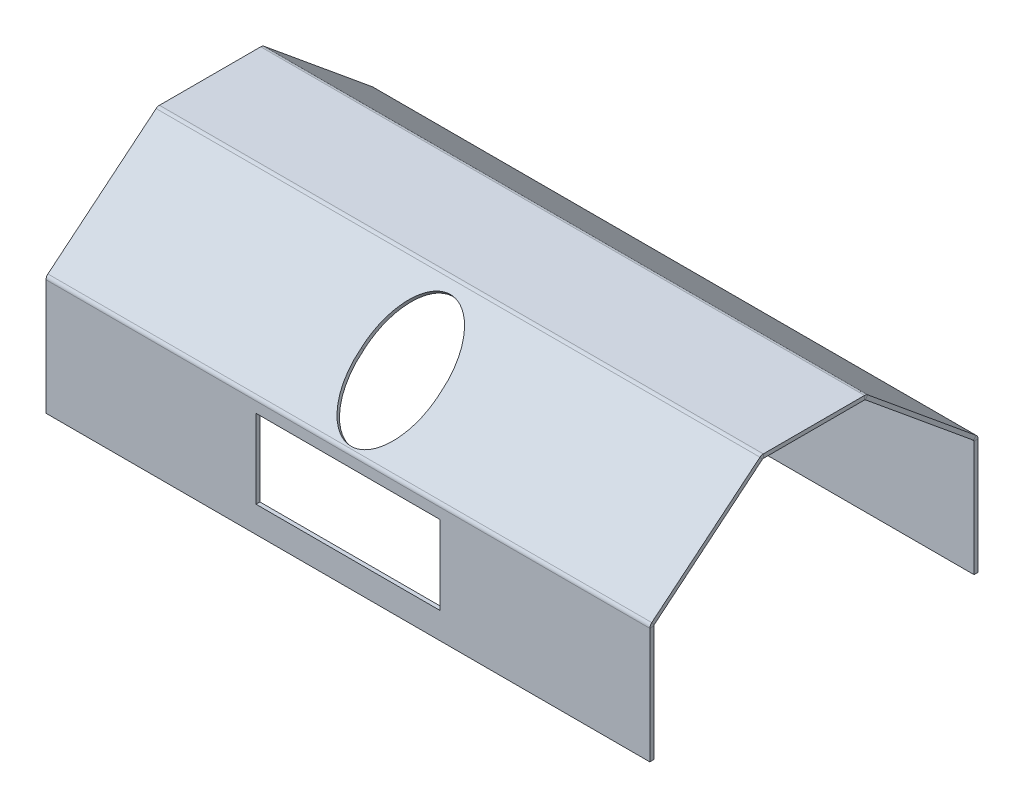
ISO-10303-21;
HEADER;
FILE_DESCRIPTION(('STEP AP214'),'2;1');
FILE_NAME('part.step','',(''),(''),'','','');
FILE_SCHEMA(('AUTOMOTIVE_DESIGN { 1 0 10303 214 1 1 1 1 }'));
ENDSEC;
DATA;
#1=APPLICATION_CONTEXT('core data for automotive mechanical design processes');
#2=APPLICATION_PROTOCOL_DEFINITION('international standard','automotive_design',2000,#1);
#3=PRODUCT_CONTEXT('',#1,'mechanical');
#4=PRODUCT('Part','Part','',(#3));
#5=PRODUCT_RELATED_PRODUCT_CATEGORY('part','',(#4));
#6=PRODUCT_DEFINITION_FORMATION('','',#4);
#7=PRODUCT_DEFINITION_CONTEXT('part definition',#1,'design');
#8=PRODUCT_DEFINITION('design','',#6,#7);
#9=PRODUCT_DEFINITION_SHAPE('','',#8);
#10=(LENGTH_UNIT() NAMED_UNIT(*) SI_UNIT(.MILLI.,.METRE.));
#11=(NAMED_UNIT(*) PLANE_ANGLE_UNIT() SI_UNIT($,.RADIAN.));
#12=(NAMED_UNIT(*) SI_UNIT($,.STERADIAN.) SOLID_ANGLE_UNIT());
#13=UNCERTAINTY_MEASURE_WITH_UNIT(LENGTH_MEASURE(1.E-05),#10,'distance_accuracy_value','');
#14=(GEOMETRIC_REPRESENTATION_CONTEXT(3) GLOBAL_UNCERTAINTY_ASSIGNED_CONTEXT((#13)) GLOBAL_UNIT_ASSIGNED_CONTEXT((#10,
#11,#12)) REPRESENTATION_CONTEXT('',''));
#15=CARTESIAN_POINT('',(0.,0.,0.));
#16=DIRECTION('',(0.,0.,1.));
#17=DIRECTION('',(1.,0.,0.));
#18=AXIS2_PLACEMENT_3D('',#15,#16,#17);
#19=CARTESIAN_POINT('',(115.,0.,62.5));
#20=DIRECTION('',(0.,0.,1.));
#21=DIRECTION('',(1.,0.,0.));
#22=AXIS2_PLACEMENT_3D('',#19,#20,#21);
#23=PLANE('',#22);
#24=DIRECTION('',(0.,1.,0.));
#25=VECTOR('',#24,1.);
#26=CARTESIAN_POINT('',(-115.,0.,62.5));
#27=LINE('',#26,#25);
#28=CARTESIAN_POINT('',(-115.,0.,62.5));
#29=VERTEX_POINT('',#28);
#30=CARTESIAN_POINT('',(-115.,44.0561511122888,62.5));
#31=VERTEX_POINT('',#30);
#32=EDGE_CURVE('E370',#29,#31,#27,.T.);
#33=ORIENTED_EDGE('',*,*,#32,.F.);
#34=DIRECTION('',(-1.,0.,0.));
#35=VECTOR('',#34,1.);
#36=CARTESIAN_POINT('',(115.,0.,62.5));
#37=LINE('',#36,#35);
#38=CARTESIAN_POINT('',(115.,0.,62.5));
#39=VERTEX_POINT('',#38);
#40=EDGE_CURVE('E424',#39,#29,#37,.T.);
#41=ORIENTED_EDGE('',*,*,#40,.F.);
#42=DIRECTION('',(0.,1.,0.));
#43=VECTOR('',#42,1.);
#44=CARTESIAN_POINT('',(115.,0.,62.5));
#45=LINE('',#44,#43);
#46=CARTESIAN_POINT('',(115.,44.0561511122888,62.5));
#47=VERTEX_POINT('',#46);
#48=EDGE_CURVE('E310',#39,#47,#45,.T.);
#49=ORIENTED_EDGE('',*,*,#48,.T.);
#50=DIRECTION('',(-1.,0.,0.));
#51=VECTOR('',#50,1.);
#52=CARTESIAN_POINT('',(115.,44.0561511122888,62.5));
#53=LINE('',#52,#51);
#54=EDGE_CURVE('E426',#47,#31,#53,.T.);
#55=ORIENTED_EDGE('',*,*,#54,.T.);
#56=EDGE_LOOP('',(#33,#41,#49,#55));
#57=FACE_BOUND('',#56,.T.);
#58=DIRECTION('',(-1.,0.,0.));
#59=VECTOR('',#58,1.);
#60=CARTESIAN_POINT('',(115.,10.,62.5));
#61=LINE('',#60,#59);
#62=CARTESIAN_POINT('',(35.,10.,62.5));
#63=VERTEX_POINT('',#62);
#64=CARTESIAN_POINT('',(-35.,9.99999999999999,62.5));
#65=VERTEX_POINT('',#64);
#66=EDGE_CURVE('E218',#63,#65,#61,.T.);
#67=ORIENTED_EDGE('',*,*,#66,.T.);
#68=DIRECTION('',(0.,1.,0.));
#69=VECTOR('',#68,1.);
#70=CARTESIAN_POINT('',(-35.,0.,62.5));
#71=LINE('',#70,#69);
#72=CARTESIAN_POINT('',(-35.,40.,62.5));
#73=VERTEX_POINT('',#72);
#74=EDGE_CURVE('E243',#65,#73,#71,.T.);
#75=ORIENTED_EDGE('',*,*,#74,.T.);
#76=DIRECTION('',(1.,0.,0.));
#77=VECTOR('',#76,1.);
#78=CARTESIAN_POINT('',(115.,40.,62.5));
#79=LINE('',#78,#77);
#80=CARTESIAN_POINT('',(35.,40.,62.5));
#81=VERTEX_POINT('',#80);
#82=EDGE_CURVE('E239',#73,#81,#79,.T.);
#83=ORIENTED_EDGE('',*,*,#82,.T.);
#84=DIRECTION('',(0.,-1.,0.));
#85=VECTOR('',#84,1.);
#86=CARTESIAN_POINT('',(35.,0.,62.5));
#87=LINE('',#86,#85);
#88=EDGE_CURVE('E237',#81,#63,#87,.T.);
#89=ORIENTED_EDGE('',*,*,#88,.T.);
#90=EDGE_LOOP('',(#67,#75,#83,#89));
#91=FACE_BOUND('',#90,.T.);
#92=ADVANCED_FACE('F36',(#57,#91),#23,.T.);
#93=CARTESIAN_POINT('',(115.,0.,61.));
#94=DIRECTION('',(0.,0.,1.));
#95=DIRECTION('',(1.,0.,0.));
#96=AXIS2_PLACEMENT_3D('',#93,#94,#95);
#97=PLANE('',#96);
#98=DIRECTION('',(0.,1.,0.));
#99=VECTOR('',#98,1.);
#100=CARTESIAN_POINT('',(-115.,0.,61.));
#101=LINE('',#100,#99);
#102=CARTESIAN_POINT('',(-115.,0.,61.));
#103=VERTEX_POINT('',#102);
#104=CARTESIAN_POINT('',(-115.,44.0561511122888,61.));
#105=VERTEX_POINT('',#104);
#106=EDGE_CURVE('E376',#103,#105,#101,.T.);
#107=ORIENTED_EDGE('',*,*,#106,.T.);
#108=DIRECTION('',(-1.,0.,0.));
#109=VECTOR('',#108,1.);
#110=CARTESIAN_POINT('',(115.,44.0561511122888,61.));
#111=LINE('',#110,#109);
#112=CARTESIAN_POINT('',(115.,44.0561511122888,61.));
#113=VERTEX_POINT('',#112);
#114=EDGE_CURVE('E419',#113,#105,#111,.T.);
#115=ORIENTED_EDGE('',*,*,#114,.F.);
#116=DIRECTION('',(0.,1.,0.));
#117=VECTOR('',#116,1.);
#118=CARTESIAN_POINT('',(115.,0.,61.));
#119=LINE('',#118,#117);
#120=CARTESIAN_POINT('',(115.,0.,61.));
#121=VERTEX_POINT('',#120);
#122=EDGE_CURVE('E316',#121,#113,#119,.T.);
#123=ORIENTED_EDGE('',*,*,#122,.F.);
#124=DIRECTION('',(-1.,0.,0.));
#125=VECTOR('',#124,1.);
#126=CARTESIAN_POINT('',(115.,0.,61.));
#127=LINE('',#126,#125);
#128=EDGE_CURVE('E422',#121,#103,#127,.T.);
#129=ORIENTED_EDGE('',*,*,#128,.T.);
#130=EDGE_LOOP('',(#107,#115,#123,#129));
#131=FACE_BOUND('',#130,.T.);
#132=DIRECTION('',(0.,1.,0.));
#133=VECTOR('',#132,1.);
#134=CARTESIAN_POINT('',(-35.,0.,61.));
#135=LINE('',#134,#133);
#136=CARTESIAN_POINT('',(-35.,9.99999999999999,61.));
#137=VERTEX_POINT('',#136);
#138=CARTESIAN_POINT('',(-35.,40.,61.));
#139=VERTEX_POINT('',#138);
#140=EDGE_CURVE('E231',#137,#139,#135,.T.);
#141=ORIENTED_EDGE('',*,*,#140,.F.);
#142=DIRECTION('',(1.,0.,0.));
#143=VECTOR('',#142,1.);
#144=CARTESIAN_POINT('',(115.,10.,61.));
#145=LINE('',#144,#143);
#146=CARTESIAN_POINT('',(35.,10.,61.));
#147=VERTEX_POINT('',#146);
#148=EDGE_CURVE('E223',#147,#137,#145,.F.);
#149=ORIENTED_EDGE('',*,*,#148,.F.);
#150=DIRECTION('',(0.,1.,0.));
#151=VECTOR('',#150,1.);
#152=CARTESIAN_POINT('',(35.,0.,61.));
#153=LINE('',#152,#151);
#154=CARTESIAN_POINT('',(35.,40.,61.));
#155=VERTEX_POINT('',#154);
#156=EDGE_CURVE('E209',#155,#147,#153,.F.);
#157=ORIENTED_EDGE('',*,*,#156,.F.);
#158=DIRECTION('',(1.,0.,0.));
#159=VECTOR('',#158,1.);
#160=CARTESIAN_POINT('',(115.,40.,61.));
#161=LINE('',#160,#159);
#162=EDGE_CURVE('E217',#139,#155,#161,.T.);
#163=ORIENTED_EDGE('',*,*,#162,.F.);
#164=EDGE_LOOP('',(#141,#149,#157,#163));
#165=FACE_BOUND('',#164,.T.);
#166=ADVANCED_FACE('F229',(#131,#165),#97,.F.);
#167=CARTESIAN_POINT('',(115.,44.0561511122888,-62.5));
#168=DIRECTION('',(1.,0.,0.));
#169=DIRECTION('',(0.,0.,-1.));
#170=AXIS2_PLACEMENT_3D('',#167,#168,#169);
#171=PLANE('',#170);
#172=DIRECTION('',(0.,0.,1.));
#173=VECTOR('',#172,1.);
#174=CARTESIAN_POINT('',(115.,44.0561511122888,-62.5));
#175=LINE('',#174,#173);
#176=CARTESIAN_POINT('',(115.,44.0561511122888,-62.5));
#177=VERTEX_POINT('',#176);
#178=CARTESIAN_POINT('',(115.,44.0561511122888,-61.));
#179=VERTEX_POINT('',#178);
#180=EDGE_CURVE('E11',#177,#179,#175,.T.);
#181=ORIENTED_EDGE('',*,*,#180,.F.);
#182=CARTESIAN_POINT('',(115.,44.0561511122888,-60.5));
#183=DIRECTION('',(-1.,0.,0.));
#184=DIRECTION('',(0.,0.,1.));
#185=AXIS2_PLACEMENT_3D('',#182,#183,#184);
#186=CIRCLE('',#185,2.);
#187=CARTESIAN_POINT('',(115.,45.6000115835229,-61.7714145057222));
#188=VERTEX_POINT('',#187);
#189=EDGE_CURVE('E289',#188,#177,#186,.T.);
#190=ORIENTED_EDGE('',*,*,#189,.F.);
#191=DIRECTION('',(0.,0.771930235617052,-0.635707252861097));
#192=VECTOR('',#191,1.);
#193=CARTESIAN_POINT('',(115.,44.4421162300973,-60.8178536264306));
#194=LINE('',#193,#192);
#195=CARTESIAN_POINT('',(115.,44.4421162300973,-60.8178536264306));
#196=VERTEX_POINT('',#195);
#197=EDGE_CURVE('E44',#196,#188,#194,.T.);
#198=ORIENTED_EDGE('',*,*,#197,.F.);
#199=CARTESIAN_POINT('',(115.,44.0561511122888,-60.5));
#200=DIRECTION('',(1.,0.,0.));
#201=DIRECTION('',(0.,0.,-1.));
#202=AXIS2_PLACEMENT_3D('',#199,#200,#201);
#203=CIRCLE('',#202,0.5);
#204=EDGE_CURVE('E337',#196,#179,#203,.F.);
#205=ORIENTED_EDGE('',*,*,#204,.T.);
#206=EDGE_LOOP('',(#181,#190,#198,#205));
#207=FACE_BOUND('',#206,.T.);
#208=ADVANCED_FACE('F38',(#207),#171,.T.);
#209=CARTESIAN_POINT('',(115.,44.4421162300973,-60.8178536264306));
#210=DIRECTION('',(1.,0.,0.));
#211=DIRECTION('',(0.,0.,-1.));
#212=AXIS2_PLACEMENT_3D('',#209,#210,#211);
#213=PLANE('',#212);
#214=DIRECTION('',(0.,-1.,0.));
#215=VECTOR('',#214,1.);
#216=CARTESIAN_POINT('',(115.,0.,-62.5));
#217=LINE('',#216,#215);
#218=CARTESIAN_POINT('',(115.,0.,-62.5));
#219=VERTEX_POINT('',#218);
#220=EDGE_CURVE('E286',#177,#219,#217,.T.);
#221=ORIENTED_EDGE('',*,*,#220,.F.);
#222=ORIENTED_EDGE('',*,*,#180,.T.);
#223=DIRECTION('',(0.,1.,0.));
#224=VECTOR('',#223,1.);
#225=CARTESIAN_POINT('',(115.,0.,-61.));
#226=LINE('',#225,#224);
#227=CARTESIAN_POINT('',(115.,0.,-61.));
#228=VERTEX_POINT('',#227);
#229=EDGE_CURVE('E280',#179,#228,#226,.F.);
#230=ORIENTED_EDGE('',*,*,#229,.T.);
#231=DIRECTION('',(0.,0.,1.));
#232=VECTOR('',#231,1.);
#233=CARTESIAN_POINT('',(115.,0.,-62.5));
#234=LINE('',#233,#232);
#235=EDGE_CURVE('E282',#219,#228,#234,.T.);
#236=ORIENTED_EDGE('',*,*,#235,.F.);
#237=EDGE_LOOP('',(#221,#222,#230,#236));
#238=FACE_BOUND('',#237,.T.);
#239=ADVANCED_FACE('F586',(#238),#213,.T.);
#240=CARTESIAN_POINT('',(-115.,45.6000115835229,-61.7714145057222));
#241=DIRECTION('',(-1.,0.,0.));
#242=DIRECTION('',(0.,0.,1.));
#243=AXIS2_PLACEMENT_3D('',#240,#241,#242);
#244=PLANE('',#243);
#245=DIRECTION('',(0.,-0.771930235617052,0.635707252861097));
#246=VECTOR('',#245,1.);
#247=CARTESIAN_POINT('',(-115.,45.6000115835229,-61.7714145057222));
#248=LINE('',#247,#246);
#249=CARTESIAN_POINT('',(-115.,45.6000115835229,-61.7714145057222));
#250=VERTEX_POINT('',#249);
#251=CARTESIAN_POINT('',(-115.,44.4421162300973,-60.8178536264306));
#252=VERTEX_POINT('',#251);
#253=EDGE_CURVE('E480',#250,#252,#248,.T.);
#254=ORIENTED_EDGE('',*,*,#253,.F.);
#255=CARTESIAN_POINT('',(-115.,44.0561511122888,-60.5));
#256=DIRECTION('',(-1.,0.,0.));
#257=DIRECTION('',(0.,0.,1.));
#258=AXIS2_PLACEMENT_3D('',#255,#256,#257);
#259=CIRCLE('',#258,2.);
#260=CARTESIAN_POINT('',(-115.,44.0561511122888,-62.5));
#261=VERTEX_POINT('',#260);
#262=EDGE_CURVE('E349',#250,#261,#259,.T.);
#263=ORIENTED_EDGE('',*,*,#262,.T.);
#264=DIRECTION('',(0.,0.,-1.));
#265=VECTOR('',#264,1.);
#266=CARTESIAN_POINT('',(-115.,44.0561511122888,-61.));
#267=LINE('',#266,#265);
#268=CARTESIAN_POINT('',(-115.,44.0561511122888,-61.));
#269=VERTEX_POINT('',#268);
#270=EDGE_CURVE('E478',#269,#261,#267,.T.);
#271=ORIENTED_EDGE('',*,*,#270,.F.);
#272=CARTESIAN_POINT('',(-115.,44.0561511122888,-60.5));
#273=DIRECTION('',(1.,0.,0.));
#274=DIRECTION('',(0.,0.,-1.));
#275=AXIS2_PLACEMENT_3D('',#272,#273,#274);
#276=CIRCLE('',#275,0.5);
#277=EDGE_CURVE('E283',#252,#269,#276,.F.);
#278=ORIENTED_EDGE('',*,*,#277,.F.);
#279=EDGE_LOOP('',(#254,#263,#271,#278));
#280=FACE_BOUND('',#279,.T.);
#281=ADVANCED_FACE('F593',(#280),#244,.T.);
#282=CARTESIAN_POINT('',(-115.,44.0561511122888,-61.));
#283=DIRECTION('',(-1.,0.,0.));
#284=DIRECTION('',(0.,0.,1.));
#285=AXIS2_PLACEMENT_3D('',#282,#283,#284);
#286=PLANE('',#285);
#287=DIRECTION('',(0.,-0.6357072528611,-0.77193023561705));
#288=VECTOR('',#287,1.);
#289=CARTESIAN_POINT('',(-115.,45.,-62.5));
#290=LINE('',#289,#288);
#291=CARTESIAN_POINT('',(-115.,79.5438604712341,-20.5538837135015));
#292=VERTEX_POINT('',#291);
#293=EDGE_CURVE('E352',#292,#250,#290,.T.);
#294=ORIENTED_EDGE('',*,*,#293,.T.);
#295=ORIENTED_EDGE('',*,*,#253,.T.);
#296=DIRECTION('',(0.,-0.6357072528611,-0.77193023561705));
#297=VECTOR('',#296,1.);
#298=CARTESIAN_POINT('',(-115.,43.8421046465744,-61.5464391207083));
#299=LINE('',#298,#297);
#300=CARTESIAN_POINT('',(-115.,78.3859651178085,-19.6003228342098));
#301=VERTEX_POINT('',#300);
#302=EDGE_CURVE('E394',#301,#252,#299,.T.);
#303=ORIENTED_EDGE('',*,*,#302,.F.);
#304=DIRECTION('',(0.,0.771930235617042,-0.635707252861109));
#305=VECTOR('',#304,1.);
#306=CARTESIAN_POINT('',(-115.,78.3859651178085,-19.6003228342098));
#307=LINE('',#306,#305);
#308=EDGE_CURVE('E470',#301,#292,#307,.T.);
#309=ORIENTED_EDGE('',*,*,#308,.T.);
#310=EDGE_LOOP('',(#294,#295,#303,#309));
#311=FACE_BOUND('',#310,.T.);
#312=ADVANCED_FACE('F595',(#311),#286,.T.);
#313=CARTESIAN_POINT('',(115.,79.5438604712341,-20.5538837135015));
#314=DIRECTION('',(1.,0.,0.));
#315=DIRECTION('',(0.,0.,-1.));
#316=AXIS2_PLACEMENT_3D('',#313,#314,#315);
#317=PLANE('',#316);
#318=DIRECTION('',(0.,-0.771930235617042,0.635707252861109));
#319=VECTOR('',#318,1.);
#320=CARTESIAN_POINT('',(115.,79.5438604712341,-20.5538837135015));
#321=LINE('',#320,#319);
#322=CARTESIAN_POINT('',(115.,79.5438604712341,-20.5538837135015));
#323=VERTEX_POINT('',#322);
#324=CARTESIAN_POINT('',(115.,78.3859651178085,-19.6003228342098));
#325=VERTEX_POINT('',#324);
#326=EDGE_CURVE('E476',#323,#325,#321,.T.);
#327=ORIENTED_EDGE('',*,*,#326,.F.);
#328=CARTESIAN_POINT('',(115.,78.,-19.2824692077793));
#329=DIRECTION('',(-1.,0.,0.));
#330=DIRECTION('',(0.,0.,1.));
#331=AXIS2_PLACEMENT_3D('',#328,#329,#330);
#332=CIRCLE('',#331,2.);
#333=CARTESIAN_POINT('',(115.,80.,-19.2824692077793));
#334=VERTEX_POINT('',#333);
#335=EDGE_CURVE('E295',#334,#323,#332,.T.);
#336=ORIENTED_EDGE('',*,*,#335,.F.);
#337=DIRECTION('',(0.,1.,0.));
#338=VECTOR('',#337,1.);
#339=CARTESIAN_POINT('',(115.,78.5,-19.2824692077793));
#340=LINE('',#339,#338);
#341=CARTESIAN_POINT('',(115.,78.5,-19.2824692077793));
#342=VERTEX_POINT('',#341);
#343=EDGE_CURVE('E474',#342,#334,#340,.T.);
#344=ORIENTED_EDGE('',*,*,#343,.F.);
#345=CARTESIAN_POINT('',(115.,78.,-19.2824692077793));
#346=DIRECTION('',(1.,0.,0.));
#347=DIRECTION('',(0.,0.,-1.));
#348=AXIS2_PLACEMENT_3D('',#345,#346,#347);
#349=CIRCLE('',#348,0.5);
#350=EDGE_CURVE('E331',#342,#325,#349,.F.);
#351=ORIENTED_EDGE('',*,*,#350,.T.);
#352=EDGE_LOOP('',(#327,#336,#344,#351));
#353=FACE_BOUND('',#352,.T.);
#354=ADVANCED_FACE('F503',(#353),#317,.T.);
#355=CARTESIAN_POINT('',(115.,78.5,-19.2824692077793));
#356=DIRECTION('',(1.,0.,0.));
#357=DIRECTION('',(0.,0.,-1.));
#358=AXIS2_PLACEMENT_3D('',#355,#356,#357);
#359=PLANE('',#358);
#360=DIRECTION('',(0.,-0.6357072528611,-0.77193023561705));
#361=VECTOR('',#360,1.);
#362=CARTESIAN_POINT('',(115.,45.,-62.5));
#363=LINE('',#362,#361);
#364=EDGE_CURVE('E292',#323,#188,#363,.T.);
#365=ORIENTED_EDGE('',*,*,#364,.F.);
#366=ORIENTED_EDGE('',*,*,#326,.T.);
#367=DIRECTION('',(0.,-0.6357072528611,-0.77193023561705));
#368=VECTOR('',#367,1.);
#369=CARTESIAN_POINT('',(115.,43.8421046465744,-61.5464391207083));
#370=LINE('',#369,#368);
#371=EDGE_CURVE('E334',#325,#196,#370,.T.);
#372=ORIENTED_EDGE('',*,*,#371,.T.);
#373=ORIENTED_EDGE('',*,*,#197,.T.);
#374=EDGE_LOOP('',(#365,#366,#372,#373));
#375=FACE_BOUND('',#374,.T.);
#376=ADVANCED_FACE('F484',(#375),#359,.T.);
#377=CARTESIAN_POINT('',(-115.,80.,-19.2824692077793));
#378=DIRECTION('',(-1.,0.,0.));
#379=DIRECTION('',(0.,0.,1.));
#380=AXIS2_PLACEMENT_3D('',#377,#378,#379);
#381=PLANE('',#380);
#382=DIRECTION('',(0.,-1.,0.));
#383=VECTOR('',#382,1.);
#384=CARTESIAN_POINT('',(-115.,80.,-19.2824692077793));
#385=LINE('',#384,#383);
#386=CARTESIAN_POINT('',(-115.,80.,-19.2824692077793));
#387=VERTEX_POINT('',#386);
#388=CARTESIAN_POINT('',(-115.,78.5,-19.2824692077793));
#389=VERTEX_POINT('',#388);
#390=EDGE_CURVE('E472',#387,#389,#385,.T.);
#391=ORIENTED_EDGE('',*,*,#390,.F.);
#392=CARTESIAN_POINT('',(-115.,78.,-19.2824692077793));
#393=DIRECTION('',(-1.,0.,0.));
#394=DIRECTION('',(0.,0.,1.));
#395=AXIS2_PLACEMENT_3D('',#392,#393,#394);
#396=CIRCLE('',#395,2.);
#397=EDGE_CURVE('E355',#387,#292,#396,.T.);
#398=ORIENTED_EDGE('',*,*,#397,.T.);
#399=ORIENTED_EDGE('',*,*,#308,.F.);
#400=CARTESIAN_POINT('',(-115.,78.,-19.2824692077793));
#401=DIRECTION('',(1.,0.,0.));
#402=DIRECTION('',(0.,0.,-1.));
#403=AXIS2_PLACEMENT_3D('',#400,#401,#402);
#404=CIRCLE('',#403,0.5);
#405=EDGE_CURVE('E391',#389,#301,#404,.F.);
#406=ORIENTED_EDGE('',*,*,#405,.F.);
#407=EDGE_LOOP('',(#391,#398,#399,#406));
#408=FACE_BOUND('',#407,.T.);
#409=ADVANCED_FACE('F597',(#408),#381,.T.);
#410=CARTESIAN_POINT('',(-115.,78.3859651178085,-19.6003228342098));
#411=DIRECTION('',(-1.,0.,0.));
#412=DIRECTION('',(0.,0.,1.));
#413=AXIS2_PLACEMENT_3D('',#410,#411,#412);
#414=PLANE('',#413);
#415=DIRECTION('',(0.,0.,-1.));
#416=VECTOR('',#415,1.);
#417=CARTESIAN_POINT('',(-115.,80.,-20.));
#418=LINE('',#417,#416);
#419=CARTESIAN_POINT('',(-115.,80.,19.2824692077793));
#420=VERTEX_POINT('',#419);
#421=EDGE_CURVE('E358',#420,#387,#418,.T.);
#422=ORIENTED_EDGE('',*,*,#421,.T.);
#423=ORIENTED_EDGE('',*,*,#390,.T.);
#424=DIRECTION('',(0.,0.,-1.));
#425=VECTOR('',#424,1.);
#426=CARTESIAN_POINT('',(-115.,78.5,-20.));
#427=LINE('',#426,#425);
#428=CARTESIAN_POINT('',(-115.,78.5,19.2824692077793));
#429=VERTEX_POINT('',#428);
#430=EDGE_CURVE('E388',#429,#389,#427,.T.);
#431=ORIENTED_EDGE('',*,*,#430,.F.);
#432=DIRECTION('',(0.,1.,0.));
#433=VECTOR('',#432,1.);
#434=CARTESIAN_POINT('',(-115.,78.5,19.2824692077793));
#435=LINE('',#434,#433);
#436=EDGE_CURVE('E462',#429,#420,#435,.T.);
#437=ORIENTED_EDGE('',*,*,#436,.T.);
#438=EDGE_LOOP('',(#422,#423,#431,#437));
#439=FACE_BOUND('',#438,.T.);
#440=ADVANCED_FACE('F599',(#439),#414,.T.);
#441=CARTESIAN_POINT('',(115.,80.,19.2824692077793));
#442=DIRECTION('',(1.,0.,0.));
#443=DIRECTION('',(0.,0.,-1.));
#444=AXIS2_PLACEMENT_3D('',#441,#442,#443);
#445=PLANE('',#444);
#446=DIRECTION('',(0.,-1.,0.));
#447=VECTOR('',#446,1.);
#448=CARTESIAN_POINT('',(115.,80.,19.2824692077793));
#449=LINE('',#448,#447);
#450=CARTESIAN_POINT('',(115.,80.,19.2824692077793));
#451=VERTEX_POINT('',#450);
#452=CARTESIAN_POINT('',(115.,78.5,19.2824692077793));
#453=VERTEX_POINT('',#452);
#454=EDGE_CURVE('E468',#451,#453,#449,.T.);
#455=ORIENTED_EDGE('',*,*,#454,.F.);
#456=CARTESIAN_POINT('',(115.,78.,19.2824692077792));
#457=DIRECTION('',(-1.,0.,0.));
#458=DIRECTION('',(0.,0.,1.));
#459=AXIS2_PLACEMENT_3D('',#456,#457,#458);
#460=CIRCLE('',#459,2.);
#461=CARTESIAN_POINT('',(115.,79.5438604712341,20.5538837135015));
#462=VERTEX_POINT('',#461);
#463=EDGE_CURVE('E301',#462,#451,#460,.T.);
#464=ORIENTED_EDGE('',*,*,#463,.F.);
#465=DIRECTION('',(0.,0.771930235617042,0.635707252861109));
#466=VECTOR('',#465,1.);
#467=CARTESIAN_POINT('',(115.,78.3859651178085,19.6003228342098));
#468=LINE('',#467,#466);
#469=CARTESIAN_POINT('',(115.,78.3859651178085,19.6003228342098));
#470=VERTEX_POINT('',#469);
#471=EDGE_CURVE('E466',#470,#462,#468,.T.);
#472=ORIENTED_EDGE('',*,*,#471,.F.);
#473=CARTESIAN_POINT('',(115.,78.,19.2824692077792));
#474=DIRECTION('',(1.,0.,0.));
#475=DIRECTION('',(0.,0.,-1.));
#476=AXIS2_PLACEMENT_3D('',#473,#474,#475);
#477=CIRCLE('',#476,0.5);
#478=EDGE_CURVE('E325',#470,#453,#477,.F.);
#479=ORIENTED_EDGE('',*,*,#478,.T.);
#480=EDGE_LOOP('',(#455,#464,#472,#479));
#481=FACE_BOUND('',#480,.T.);
#482=ADVANCED_FACE('F517',(#481),#445,.T.);
#483=CARTESIAN_POINT('',(115.,78.3859651178085,19.6003228342098));
#484=DIRECTION('',(1.,0.,0.));
#485=DIRECTION('',(0.,0.,-1.));
#486=AXIS2_PLACEMENT_3D('',#483,#484,#485);
#487=PLANE('',#486);
#488=DIRECTION('',(0.,0.,-1.));
#489=VECTOR('',#488,1.);
#490=CARTESIAN_POINT('',(115.,80.,-20.));
#491=LINE('',#490,#489);
#492=EDGE_CURVE('E298',#451,#334,#491,.T.);
#493=ORIENTED_EDGE('',*,*,#492,.F.);
#494=ORIENTED_EDGE('',*,*,#454,.T.);
#495=DIRECTION('',(0.,0.,-1.));
#496=VECTOR('',#495,1.);
#497=CARTESIAN_POINT('',(115.,78.5,-20.));
#498=LINE('',#497,#496);
#499=EDGE_CURVE('E328',#453,#342,#498,.T.);
#500=ORIENTED_EDGE('',*,*,#499,.T.);
#501=ORIENTED_EDGE('',*,*,#343,.T.);
#502=EDGE_LOOP('',(#493,#494,#500,#501));
#503=FACE_BOUND('',#502,.T.);
#504=ADVANCED_FACE('F510',(#503),#487,.T.);
#505=CARTESIAN_POINT('',(-115.,79.5438604712341,20.5538837135015));
#506=DIRECTION('',(-1.,0.,0.));
#507=DIRECTION('',(0.,0.,1.));
#508=AXIS2_PLACEMENT_3D('',#505,#506,#507);
#509=PLANE('',#508);
#510=DIRECTION('',(0.,-0.771930235617042,-0.635707252861109));
#511=VECTOR('',#510,1.);
#512=CARTESIAN_POINT('',(-115.,79.5438604712341,20.5538837135015));
#513=LINE('',#512,#511);
#514=CARTESIAN_POINT('',(-115.,79.5438604712341,20.5538837135015));
#515=VERTEX_POINT('',#514);
#516=CARTESIAN_POINT('',(-115.,78.3859651178085,19.6003228342098));
#517=VERTEX_POINT('',#516);
#518=EDGE_CURVE('E464',#515,#517,#513,.T.);
#519=ORIENTED_EDGE('',*,*,#518,.F.);
#520=CARTESIAN_POINT('',(-115.,78.,19.2824692077792));
#521=DIRECTION('',(-1.,0.,0.));
#522=DIRECTION('',(0.,0.,1.));
#523=AXIS2_PLACEMENT_3D('',#520,#521,#522);
#524=CIRCLE('',#523,2.);
#525=EDGE_CURVE('E361',#515,#420,#524,.T.);
#526=ORIENTED_EDGE('',*,*,#525,.T.);
#527=ORIENTED_EDGE('',*,*,#436,.F.);
#528=CARTESIAN_POINT('',(-115.,78.,19.2824692077792));
#529=DIRECTION('',(1.,0.,0.));
#530=DIRECTION('',(0.,0.,-1.));
#531=AXIS2_PLACEMENT_3D('',#528,#529,#530);
#532=CIRCLE('',#531,0.5);
#533=EDGE_CURVE('E385',#517,#429,#532,.F.);
#534=ORIENTED_EDGE('',*,*,#533,.F.);
#535=EDGE_LOOP('',(#519,#526,#527,#534));
#536=FACE_BOUND('',#535,.T.);
#537=ADVANCED_FACE('F601',(#536),#509,.T.);
#538=CARTESIAN_POINT('',(-115.,78.5,19.2824692077793));
#539=DIRECTION('',(-1.,0.,0.));
#540=DIRECTION('',(0.,0.,1.));
#541=AXIS2_PLACEMENT_3D('',#538,#539,#540);
#542=PLANE('',#541);
#543=DIRECTION('',(0.,0.6357072528611,-0.77193023561705));
#544=VECTOR('',#543,1.);
#545=CARTESIAN_POINT('',(-115.,45.,62.5));
#546=LINE('',#545,#544);
#547=CARTESIAN_POINT('',(-115.,45.6000115835229,61.7714145057222));
#548=VERTEX_POINT('',#547);
#549=EDGE_CURVE('E364',#548,#515,#546,.T.);
#550=ORIENTED_EDGE('',*,*,#549,.T.);
#551=ORIENTED_EDGE('',*,*,#518,.T.);
#552=DIRECTION('',(0.,0.6357072528611,-0.77193023561705));
#553=VECTOR('',#552,1.);
#554=CARTESIAN_POINT('',(-115.,43.8421046465744,61.5464391207083));
#555=LINE('',#554,#553);
#556=CARTESIAN_POINT('',(-115.,44.4421162300973,60.8178536264305));
#557=VERTEX_POINT('',#556);
#558=EDGE_CURVE('E382',#557,#517,#555,.T.);
#559=ORIENTED_EDGE('',*,*,#558,.F.);
#560=DIRECTION('',(0.,0.771930235617048,0.635707252861102));
#561=VECTOR('',#560,1.);
#562=CARTESIAN_POINT('',(-115.,44.4421162300973,60.8178536264305));
#563=LINE('',#562,#561);
#564=EDGE_CURVE('E454',#557,#548,#563,.T.);
#565=ORIENTED_EDGE('',*,*,#564,.T.);
#566=EDGE_LOOP('',(#550,#551,#559,#565));
#567=FACE_BOUND('',#566,.T.);
#568=ADVANCED_FACE('F603',(#567),#542,.T.);
#569=CARTESIAN_POINT('',(115.,45.6000115835229,61.7714145057222));
#570=DIRECTION('',(1.,0.,0.));
#571=DIRECTION('',(0.,0.,-1.));
#572=AXIS2_PLACEMENT_3D('',#569,#570,#571);
#573=PLANE('',#572);
#574=DIRECTION('',(0.,-0.771930235617048,-0.635707252861102));
#575=VECTOR('',#574,1.);
#576=CARTESIAN_POINT('',(115.,45.6000115835229,61.7714145057222));
#577=LINE('',#576,#575);
#578=CARTESIAN_POINT('',(115.,45.6000115835229,61.7714145057222));
#579=VERTEX_POINT('',#578);
#580=CARTESIAN_POINT('',(115.,44.4421162300973,60.8178536264305));
#581=VERTEX_POINT('',#580);
#582=EDGE_CURVE('E460',#579,#581,#577,.T.);
#583=ORIENTED_EDGE('',*,*,#582,.F.);
#584=CARTESIAN_POINT('',(115.,44.0561511122888,60.5));
#585=DIRECTION('',(-1.,0.,0.));
#586=DIRECTION('',(0.,0.,1.));
#587=AXIS2_PLACEMENT_3D('',#584,#585,#586);
#588=CIRCLE('',#587,2.);
#589=EDGE_CURVE('E307',#47,#579,#588,.T.);
#590=ORIENTED_EDGE('',*,*,#589,.F.);
#591=DIRECTION('',(0.,0.,1.));
#592=VECTOR('',#591,1.);
#593=CARTESIAN_POINT('',(115.,44.0561511122888,61.));
#594=LINE('',#593,#592);
#595=EDGE_CURVE('E458',#113,#47,#594,.T.);
#596=ORIENTED_EDGE('',*,*,#595,.F.);
#597=CARTESIAN_POINT('',(115.,44.0561511122888,60.5));
#598=DIRECTION('',(1.,0.,0.));
#599=DIRECTION('',(0.,0.,-1.));
#600=AXIS2_PLACEMENT_3D('',#597,#598,#599);
#601=CIRCLE('',#600,0.5);
#602=EDGE_CURVE('E319',#113,#581,#601,.F.);
#603=ORIENTED_EDGE('',*,*,#602,.T.);
#604=EDGE_LOOP('',(#583,#590,#596,#603));
#605=FACE_BOUND('',#604,.T.);
#606=ADVANCED_FACE('F531',(#605),#573,.T.);
#607=CARTESIAN_POINT('',(115.,44.0561511122888,61.));
#608=DIRECTION('',(1.,0.,0.));
#609=DIRECTION('',(0.,0.,-1.));
#610=AXIS2_PLACEMENT_3D('',#607,#608,#609);
#611=PLANE('',#610);
#612=DIRECTION('',(0.,0.6357072528611,-0.77193023561705));
#613=VECTOR('',#612,1.);
#614=CARTESIAN_POINT('',(115.,45.,62.5));
#615=LINE('',#614,#613);
#616=EDGE_CURVE('E304',#579,#462,#615,.T.);
#617=ORIENTED_EDGE('',*,*,#616,.F.);
#618=ORIENTED_EDGE('',*,*,#582,.T.);
#619=DIRECTION('',(0.,0.6357072528611,-0.77193023561705));
#620=VECTOR('',#619,1.);
#621=CARTESIAN_POINT('',(115.,43.8421046465744,61.5464391207083));
#622=LINE('',#621,#620);
#623=EDGE_CURVE('E322',#581,#470,#622,.T.);
#624=ORIENTED_EDGE('',*,*,#623,.T.);
#625=ORIENTED_EDGE('',*,*,#471,.T.);
#626=EDGE_LOOP('',(#617,#618,#624,#625));
#627=FACE_BOUND('',#626,.T.);
#628=ADVANCED_FACE('F524',(#627),#611,.T.);
#629=CARTESIAN_POINT('',(-115.,44.0561511122888,62.5));
#630=DIRECTION('',(-1.,0.,0.));
#631=DIRECTION('',(0.,0.,1.));
#632=AXIS2_PLACEMENT_3D('',#629,#630,#631);
#633=PLANE('',#632);
#634=DIRECTION('',(0.,0.,-1.));
#635=VECTOR('',#634,1.);
#636=CARTESIAN_POINT('',(-115.,44.0561511122888,62.5));
#637=LINE('',#636,#635);
#638=EDGE_CURVE('E456',#31,#105,#637,.T.);
#639=ORIENTED_EDGE('',*,*,#638,.F.);
#640=CARTESIAN_POINT('',(-115.,44.0561511122888,60.5));
#641=DIRECTION('',(-1.,0.,0.));
#642=DIRECTION('',(0.,0.,1.));
#643=AXIS2_PLACEMENT_3D('',#640,#641,#642);
#644=CIRCLE('',#643,2.);
#645=EDGE_CURVE('E367',#31,#548,#644,.T.);
#646=ORIENTED_EDGE('',*,*,#645,.T.);
#647=ORIENTED_EDGE('',*,*,#564,.F.);
#648=CARTESIAN_POINT('',(-115.,44.0561511122888,60.5));
#649=DIRECTION('',(1.,0.,0.));
#650=DIRECTION('',(0.,0.,-1.));
#651=AXIS2_PLACEMENT_3D('',#648,#649,#650);
#652=CIRCLE('',#651,0.5);
#653=EDGE_CURVE('E379',#105,#557,#652,.F.);
#654=ORIENTED_EDGE('',*,*,#653,.F.);
#655=EDGE_LOOP('',(#639,#646,#647,#654));
#656=FACE_BOUND('',#655,.T.);
#657=ADVANCED_FACE('F605',(#656),#633,.T.);
#658=CARTESIAN_POINT('',(-115.,44.4421162300973,60.8178536264305));
#659=DIRECTION('',(-1.,0.,0.));
#660=DIRECTION('',(0.,0.,1.));
#661=AXIS2_PLACEMENT_3D('',#658,#659,#660);
#662=PLANE('',#661);
#663=ORIENTED_EDGE('',*,*,#32,.T.);
#664=ORIENTED_EDGE('',*,*,#638,.T.);
#665=ORIENTED_EDGE('',*,*,#106,.F.);
#666=DIRECTION('',(0.,0.,1.));
#667=VECTOR('',#666,1.);
#668=CARTESIAN_POINT('',(-115.,0.,61.));
#669=LINE('',#668,#667);
#670=EDGE_CURVE('E373',#103,#29,#669,.T.);
#671=ORIENTED_EDGE('',*,*,#670,.T.);
#672=EDGE_LOOP('',(#663,#664,#665,#671));
#673=FACE_BOUND('',#672,.T.);
#674=ADVANCED_FACE('F607',(#673),#662,.T.);
#675=CARTESIAN_POINT('',(115.,0.,-61.));
#676=DIRECTION('',(0.,0.,-1.));
#677=DIRECTION('',(-1.,0.,0.));
#678=AXIS2_PLACEMENT_3D('',#675,#676,#677);
#679=PLANE('',#678);
#680=DIRECTION('',(0.,1.,0.));
#681=VECTOR('',#680,1.);
#682=CARTESIAN_POINT('',(-115.,0.,-61.));
#683=LINE('',#682,#681);
#684=CARTESIAN_POINT('',(-115.,0.,-61.));
#685=VERTEX_POINT('',#684);
#686=EDGE_CURVE('E249',#269,#685,#683,.F.);
#687=ORIENTED_EDGE('',*,*,#686,.T.);
#688=DIRECTION('',(-1.,0.,0.));
#689=VECTOR('',#688,1.);
#690=CARTESIAN_POINT('',(115.,0.,-61.));
#691=LINE('',#690,#689);
#692=EDGE_CURVE('E452',#228,#685,#691,.T.);
#693=ORIENTED_EDGE('',*,*,#692,.F.);
#694=ORIENTED_EDGE('',*,*,#229,.F.);
#695=DIRECTION('',(-1.,0.,0.));
#696=VECTOR('',#695,1.);
#697=CARTESIAN_POINT('',(115.,44.0561511122888,-61.));
#698=LINE('',#697,#696);
#699=EDGE_CURVE('E340',#179,#269,#698,.T.);
#700=ORIENTED_EDGE('',*,*,#699,.T.);
#701=EDGE_LOOP('',(#687,#693,#694,#700));
#702=FACE_BOUND('',#701,.T.);
#703=ADVANCED_FACE('F582',(#702),#679,.F.);
#704=CARTESIAN_POINT('',(115.,0.,-62.5));
#705=DIRECTION('',(0.,-1.,0.));
#706=DIRECTION('',(0.,0.,-1.));
#707=AXIS2_PLACEMENT_3D('',#704,#705,#706);
#708=PLANE('',#707);
#709=DIRECTION('',(0.,0.,1.));
#710=VECTOR('',#709,1.);
#711=CARTESIAN_POINT('',(-115.,0.,-62.5));
#712=LINE('',#711,#710);
#713=CARTESIAN_POINT('',(-115.,0.,-62.5));
#714=VERTEX_POINT('',#713);
#715=EDGE_CURVE('E343',#714,#685,#712,.T.);
#716=ORIENTED_EDGE('',*,*,#715,.F.);
#717=DIRECTION('',(-1.,0.,0.));
#718=VECTOR('',#717,1.);
#719=CARTESIAN_POINT('',(115.,0.,-62.5));
#720=LINE('',#719,#718);
#721=EDGE_CURVE('E450',#219,#714,#720,.T.);
#722=ORIENTED_EDGE('',*,*,#721,.F.);
#723=ORIENTED_EDGE('',*,*,#235,.T.);
#724=ORIENTED_EDGE('',*,*,#692,.T.);
#725=EDGE_LOOP('',(#716,#722,#723,#724));
#726=FACE_BOUND('',#725,.T.);
#727=ADVANCED_FACE('F614',(#726),#708,.T.);
#728=CARTESIAN_POINT('',(115.,0.,-62.5));
#729=DIRECTION('',(0.,0.,-1.));
#730=DIRECTION('',(-1.,0.,0.));
#731=AXIS2_PLACEMENT_3D('',#728,#729,#730);
#732=PLANE('',#731);
#733=DIRECTION('',(0.,-1.,0.));
#734=VECTOR('',#733,1.);
#735=CARTESIAN_POINT('',(-115.,0.,-62.5));
#736=LINE('',#735,#734);
#737=EDGE_CURVE('E346',#261,#714,#736,.T.);
#738=ORIENTED_EDGE('',*,*,#737,.F.);
#739=DIRECTION('',(-1.,0.,0.));
#740=VECTOR('',#739,1.);
#741=CARTESIAN_POINT('',(115.,44.0561511122888,-62.5));
#742=LINE('',#741,#740);
#743=EDGE_CURVE('E447',#177,#261,#742,.T.);
#744=ORIENTED_EDGE('',*,*,#743,.F.);
#745=ORIENTED_EDGE('',*,*,#220,.T.);
#746=ORIENTED_EDGE('',*,*,#721,.T.);
#747=EDGE_LOOP('',(#738,#744,#745,#746));
#748=FACE_BOUND('',#747,.T.);
#749=ADVANCED_FACE('F589',(#748),#732,.T.);
#750=CARTESIAN_POINT('',(115.,44.0561511122888,-60.5));
#751=DIRECTION('',(-1.,0.,0.));
#752=DIRECTION('',(0.,0.,1.));
#753=AXIS2_PLACEMENT_3D('',#750,#751,#752);
#754=CYLINDRICAL_SURFACE('',#753,2.);
#755=ORIENTED_EDGE('',*,*,#262,.F.);
#756=DIRECTION('',(-1.,0.,0.));
#757=VECTOR('',#756,1.);
#758=CARTESIAN_POINT('',(115.,45.6000115835229,-61.7714145057222));
#759=LINE('',#758,#757);
#760=EDGE_CURVE('E444',#188,#250,#759,.T.);
#761=ORIENTED_EDGE('',*,*,#760,.F.);
#762=ORIENTED_EDGE('',*,*,#189,.T.);
#763=ORIENTED_EDGE('',*,*,#743,.T.);
#764=EDGE_LOOP('',(#755,#761,#762,#763));
#765=FACE_BOUND('',#764,.T.);
#766=ADVANCED_FACE('F491',(#765),#754,.T.);
#767=CARTESIAN_POINT('',(115.,45.,-62.5));
#768=DIRECTION('',(0.,0.77193023561705,-0.6357072528611));
#769=DIRECTION('',(0.,0.6357072528611,0.77193023561705));
#770=AXIS2_PLACEMENT_3D('',#767,#768,#769);
#771=PLANE('',#770);
#772=ORIENTED_EDGE('',*,*,#293,.F.);
#773=DIRECTION('',(-1.,0.,0.));
#774=VECTOR('',#773,1.);
#775=CARTESIAN_POINT('',(115.,79.5438604712341,-20.5538837135015));
#776=LINE('',#775,#774);
#777=EDGE_CURVE('E441',#323,#292,#776,.T.);
#778=ORIENTED_EDGE('',*,*,#777,.F.);
#779=ORIENTED_EDGE('',*,*,#364,.T.);
#780=ORIENTED_EDGE('',*,*,#760,.T.);
#781=EDGE_LOOP('',(#772,#778,#779,#780));
#782=FACE_BOUND('',#781,.T.);
#783=ADVANCED_FACE('F496',(#782),#771,.T.);
#784=CARTESIAN_POINT('',(115.,78.,-19.2824692077793));
#785=DIRECTION('',(-1.,0.,0.));
#786=DIRECTION('',(0.,0.,1.));
#787=AXIS2_PLACEMENT_3D('',#784,#785,#786);
#788=CYLINDRICAL_SURFACE('',#787,2.);
#789=ORIENTED_EDGE('',*,*,#397,.F.);
#790=DIRECTION('',(-1.,0.,0.));
#791=VECTOR('',#790,1.);
#792=CARTESIAN_POINT('',(115.,80.,-19.2824692077793));
#793=LINE('',#792,#791);
#794=EDGE_CURVE('E438',#334,#387,#793,.T.);
#795=ORIENTED_EDGE('',*,*,#794,.F.);
#796=ORIENTED_EDGE('',*,*,#335,.T.);
#797=ORIENTED_EDGE('',*,*,#777,.T.);
#798=EDGE_LOOP('',(#789,#795,#796,#797));
#799=FACE_BOUND('',#798,.T.);
#800=ADVANCED_FACE('F499',(#799),#788,.T.);
#801=CARTESIAN_POINT('',(115.,80.,-20.));
#802=DIRECTION('',(0.,1.,0.));
#803=DIRECTION('',(0.,0.,1.));
#804=AXIS2_PLACEMENT_3D('',#801,#802,#803);
#805=PLANE('',#804);
#806=ORIENTED_EDGE('',*,*,#421,.F.);
#807=DIRECTION('',(-1.,0.,0.));
#808=VECTOR('',#807,1.);
#809=CARTESIAN_POINT('',(115.,80.,19.2824692077793));
#810=LINE('',#809,#808);
#811=EDGE_CURVE('E435',#451,#420,#810,.T.);
#812=ORIENTED_EDGE('',*,*,#811,.F.);
#813=ORIENTED_EDGE('',*,*,#492,.T.);
#814=ORIENTED_EDGE('',*,*,#794,.T.);
#815=EDGE_LOOP('',(#806,#812,#813,#814));
#816=FACE_BOUND('',#815,.T.);
#817=ADVANCED_FACE('F508',(#816),#805,.T.);
#818=CARTESIAN_POINT('',(115.,78.,19.2824692077792));
#819=DIRECTION('',(-1.,0.,0.));
#820=DIRECTION('',(0.,0.,1.));
#821=AXIS2_PLACEMENT_3D('',#818,#819,#820);
#822=CYLINDRICAL_SURFACE('',#821,2.);
#823=ORIENTED_EDGE('',*,*,#525,.F.);
#824=DIRECTION('',(-1.,0.,0.));
#825=VECTOR('',#824,1.);
#826=CARTESIAN_POINT('',(115.,79.5438604712341,20.5538837135015));
#827=LINE('',#826,#825);
#828=EDGE_CURVE('E432',#462,#515,#827,.T.);
#829=ORIENTED_EDGE('',*,*,#828,.F.);
#830=ORIENTED_EDGE('',*,*,#463,.T.);
#831=ORIENTED_EDGE('',*,*,#811,.T.);
#832=EDGE_LOOP('',(#823,#829,#830,#831));
#833=FACE_BOUND('',#832,.T.);
#834=ADVANCED_FACE('F515',(#833),#822,.T.);
#835=CARTESIAN_POINT('',(115.,45.,62.5));
#836=DIRECTION('',(0.,0.77193023561705,0.6357072528611));
#837=DIRECTION('',(0.,-0.6357072528611,0.77193023561705));
#838=AXIS2_PLACEMENT_3D('',#835,#836,#837);
#839=PLANE('',#838);
#840=CARTESIAN_POINT('',(0.,62.1578953534256,41.6654127851261));
#841=DIRECTION('',(0.,0.771930235617049,0.6357072528611));
#842=DIRECTION('',(0.,0.6357072528611,-0.77193023561705));
#843=AXIS2_PLACEMENT_3D('',#840,#841,#842);
#844=ELLIPSE('',#843,23.5957666559413,15.);
#845=CARTESIAN_POINT('',(-14.9888231555256,61.5789476767063,42.3684206782853));
#846=VERTEX_POINT('',#845);
#847=CARTESIAN_POINT('',(14.9888231555256,61.5789476767063,42.3684206782853));
#848=VERTEX_POINT('',#847);
#849=EDGE_CURVE('E251',#846,#848,#844,.F.);
#850=ORIENTED_EDGE('',*,*,#849,.T.);
#851=CARTESIAN_POINT('',(0.,61.,43.0714285714286));
#852=DIRECTION('',(0.,0.77193023561705,0.6357072528611));
#853=DIRECTION('',(0.,0.6357072528611,-0.77193023561705));
#854=AXIS2_PLACEMENT_3D('',#851,#852,#853);
#855=ELLIPSE('',#854,23.5957666559413,15.);
#856=EDGE_CURVE('E51',#848,#846,#855,.F.);
#857=ORIENTED_EDGE('',*,*,#856,.T.);
#858=EDGE_LOOP('',(#850,#857));
#859=FACE_BOUND('',#858,.T.);
#860=ORIENTED_EDGE('',*,*,#549,.F.);
#861=DIRECTION('',(-1.,0.,0.));
#862=VECTOR('',#861,1.);
#863=CARTESIAN_POINT('',(115.,45.6000115835229,61.7714145057222));
#864=LINE('',#863,#862);
#865=EDGE_CURVE('E429',#579,#548,#864,.T.);
#866=ORIENTED_EDGE('',*,*,#865,.F.);
#867=ORIENTED_EDGE('',*,*,#616,.T.);
#868=ORIENTED_EDGE('',*,*,#828,.T.);
#869=EDGE_LOOP('',(#860,#866,#867,#868));
#870=FACE_BOUND('',#869,.T.);
#871=ADVANCED_FACE('F522',(#859,#870),#839,.T.);
#872=CARTESIAN_POINT('',(115.,44.0561511122888,60.5));
#873=DIRECTION('',(-1.,0.,0.));
#874=DIRECTION('',(0.,0.,1.));
#875=AXIS2_PLACEMENT_3D('',#872,#873,#874);
#876=CYLINDRICAL_SURFACE('',#875,2.);
#877=ORIENTED_EDGE('',*,*,#645,.F.);
#878=ORIENTED_EDGE('',*,*,#54,.F.);
#879=ORIENTED_EDGE('',*,*,#589,.T.);
#880=ORIENTED_EDGE('',*,*,#865,.T.);
#881=EDGE_LOOP('',(#877,#878,#879,#880));
#882=FACE_BOUND('',#881,.T.);
#883=ADVANCED_FACE('F529',(#882),#876,.T.);
#884=CARTESIAN_POINT('',(115.,0.,61.));
#885=DIRECTION('',(0.,-1.,0.));
#886=DIRECTION('',(0.,0.,-1.));
#887=AXIS2_PLACEMENT_3D('',#884,#885,#886);
#888=PLANE('',#887);
#889=ORIENTED_EDGE('',*,*,#670,.F.);
#890=ORIENTED_EDGE('',*,*,#128,.F.);
#891=DIRECTION('',(0.,0.,1.));
#892=VECTOR('',#891,1.);
#893=CARTESIAN_POINT('',(115.,0.,61.));
#894=LINE('',#893,#892);
#895=EDGE_CURVE('E313',#121,#39,#894,.T.);
#896=ORIENTED_EDGE('',*,*,#895,.T.);
#897=ORIENTED_EDGE('',*,*,#40,.T.);
#898=EDGE_LOOP('',(#889,#890,#896,#897));
#899=FACE_BOUND('',#898,.T.);
#900=ADVANCED_FACE('F540',(#899),#888,.T.);
#901=CARTESIAN_POINT('',(115.,44.0561511122888,60.5));
#902=DIRECTION('',(-1.,0.,0.));
#903=DIRECTION('',(0.,0.,1.));
#904=AXIS2_PLACEMENT_3D('',#901,#902,#903);
#905=CYLINDRICAL_SURFACE('',#904,0.5);
#906=ORIENTED_EDGE('',*,*,#653,.T.);
#907=DIRECTION('',(-1.,0.,0.));
#908=VECTOR('',#907,1.);
#909=CARTESIAN_POINT('',(115.,44.4421162300973,60.8178536264305));
#910=LINE('',#909,#908);
#911=EDGE_CURVE('E416',#581,#557,#910,.T.);
#912=ORIENTED_EDGE('',*,*,#911,.F.);
#913=ORIENTED_EDGE('',*,*,#602,.F.);
#914=ORIENTED_EDGE('',*,*,#114,.T.);
#915=EDGE_LOOP('',(#906,#912,#913,#914));
#916=FACE_BOUND('',#915,.T.);
#917=ADVANCED_FACE('F549',(#916),#905,.F.);
#918=CARTESIAN_POINT('',(115.,43.8421046465744,61.5464391207083));
#919=DIRECTION('',(0.,0.771930235617049,0.6357072528611));
#920=DIRECTION('',(0.,-0.6357072528611,0.77193023561705));
#921=AXIS2_PLACEMENT_3D('',#918,#919,#920);
#922=PLANE('',#921);
#923=CARTESIAN_POINT('',(0.,59.8421046465744,42.1178676921369));
#924=DIRECTION('',(0.,0.77193023561705,0.6357072528611));
#925=DIRECTION('',(0.,0.6357072528611,-0.77193023561705));
#926=AXIS2_PLACEMENT_3D('',#923,#924,#925);
#927=ELLIPSE('',#926,23.5957666559413,15.);
#928=CARTESIAN_POINT('',(14.9888231555259,60.4210523232807,41.4148597989936));
#929=VERTEX_POINT('',#928);
#930=CARTESIAN_POINT('',(-14.9888231555256,60.4210523232807,41.4148597989936));
#931=VERTEX_POINT('',#930);
#932=EDGE_CURVE('E240',#929,#931,#927,.F.);
#933=ORIENTED_EDGE('',*,*,#932,.F.);
#934=CARTESIAN_POINT('',(0.,61.,40.7118519058345));
#935=DIRECTION('',(0.,0.771930235617049,0.6357072528611));
#936=DIRECTION('',(0.,0.6357072528611,-0.77193023561705));
#937=AXIS2_PLACEMENT_3D('',#934,#935,#936);
#938=ELLIPSE('',#937,23.5957666559413,15.);
#939=EDGE_CURVE('E255',#931,#929,#938,.F.);
#940=ORIENTED_EDGE('',*,*,#939,.F.);
#941=EDGE_LOOP('',(#933,#940));
#942=FACE_BOUND('',#941,.T.);
#943=ORIENTED_EDGE('',*,*,#558,.T.);
#944=DIRECTION('',(-1.,0.,0.));
#945=VECTOR('',#944,1.);
#946=CARTESIAN_POINT('',(115.,78.3859651178085,19.6003228342098));
#947=LINE('',#946,#945);
#948=EDGE_CURVE('E413',#470,#517,#947,.T.);
#949=ORIENTED_EDGE('',*,*,#948,.F.);
#950=ORIENTED_EDGE('',*,*,#623,.F.);
#951=ORIENTED_EDGE('',*,*,#911,.T.);
#952=EDGE_LOOP('',(#943,#949,#950,#951));
#953=FACE_BOUND('',#952,.T.);
#954=ADVANCED_FACE('F554',(#942,#953),#922,.F.);
#955=CARTESIAN_POINT('',(115.,78.,19.2824692077792));
#956=DIRECTION('',(-1.,0.,0.));
#957=DIRECTION('',(0.,0.,1.));
#958=AXIS2_PLACEMENT_3D('',#955,#956,#957);
#959=CYLINDRICAL_SURFACE('',#958,0.5);
#960=ORIENTED_EDGE('',*,*,#533,.T.);
#961=DIRECTION('',(-1.,0.,0.));
#962=VECTOR('',#961,1.);
#963=CARTESIAN_POINT('',(115.,78.5,19.2824692077793));
#964=LINE('',#963,#962);
#965=EDGE_CURVE('E410',#453,#429,#964,.T.);
#966=ORIENTED_EDGE('',*,*,#965,.F.);
#967=ORIENTED_EDGE('',*,*,#478,.F.);
#968=ORIENTED_EDGE('',*,*,#948,.T.);
#969=EDGE_LOOP('',(#960,#966,#967,#968));
#970=FACE_BOUND('',#969,.T.);
#971=ADVANCED_FACE('F559',(#970),#959,.F.);
#972=CARTESIAN_POINT('',(115.,78.5,-20.));
#973=DIRECTION('',(0.,1.,0.));
#974=DIRECTION('',(0.,0.,1.));
#975=AXIS2_PLACEMENT_3D('',#972,#973,#974);
#976=PLANE('',#975);
#977=ORIENTED_EDGE('',*,*,#430,.T.);
#978=DIRECTION('',(-1.,0.,0.));
#979=VECTOR('',#978,1.);
#980=CARTESIAN_POINT('',(115.,78.5,-19.2824692077793));
#981=LINE('',#980,#979);
#982=EDGE_CURVE('E407',#342,#389,#981,.T.);
#983=ORIENTED_EDGE('',*,*,#982,.F.);
#984=ORIENTED_EDGE('',*,*,#499,.F.);
#985=ORIENTED_EDGE('',*,*,#965,.T.);
#986=EDGE_LOOP('',(#977,#983,#984,#985));
#987=FACE_BOUND('',#986,.T.);
#988=ADVANCED_FACE('F564',(#987),#976,.F.);
#989=CARTESIAN_POINT('',(115.,78.,-19.2824692077793));
#990=DIRECTION('',(-1.,0.,0.));
#991=DIRECTION('',(0.,0.,1.));
#992=AXIS2_PLACEMENT_3D('',#989,#990,#991);
#993=CYLINDRICAL_SURFACE('',#992,0.5);
#994=ORIENTED_EDGE('',*,*,#405,.T.);
#995=DIRECTION('',(-1.,0.,0.));
#996=VECTOR('',#995,1.);
#997=CARTESIAN_POINT('',(115.,78.3859651178085,-19.6003228342098));
#998=LINE('',#997,#996);
#999=EDGE_CURVE('E404',#325,#301,#998,.T.);
#1000=ORIENTED_EDGE('',*,*,#999,.F.);
#1001=ORIENTED_EDGE('',*,*,#350,.F.);
#1002=ORIENTED_EDGE('',*,*,#982,.T.);
#1003=EDGE_LOOP('',(#994,#1000,#1001,#1002));
#1004=FACE_BOUND('',#1003,.T.);
#1005=ADVANCED_FACE('F569',(#1004),#993,.F.);
#1006=CARTESIAN_POINT('',(115.,43.8421046465744,-61.5464391207083));
#1007=DIRECTION('',(0.,0.771930235617049,-0.6357072528611));
#1008=DIRECTION('',(0.,0.6357072528611,0.77193023561705));
#1009=AXIS2_PLACEMENT_3D('',#1006,#1007,#1008);
#1010=PLANE('',#1009);
#1011=ORIENTED_EDGE('',*,*,#302,.T.);
#1012=DIRECTION('',(-1.,0.,0.));
#1013=VECTOR('',#1012,1.);
#1014=CARTESIAN_POINT('',(115.,44.4421162300973,-60.8178536264306));
#1015=LINE('',#1014,#1013);
#1016=EDGE_CURVE('E401',#196,#252,#1015,.T.);
#1017=ORIENTED_EDGE('',*,*,#1016,.F.);
#1018=ORIENTED_EDGE('',*,*,#371,.F.);
#1019=ORIENTED_EDGE('',*,*,#999,.T.);
#1020=EDGE_LOOP('',(#1011,#1017,#1018,#1019));
#1021=FACE_BOUND('',#1020,.T.);
#1022=ADVANCED_FACE('F572',(#1021),#1010,.F.);
#1023=CARTESIAN_POINT('',(115.,44.0561511122888,-60.5));
#1024=DIRECTION('',(-1.,0.,0.));
#1025=DIRECTION('',(0.,0.,1.));
#1026=AXIS2_PLACEMENT_3D('',#1023,#1024,#1025);
#1027=CYLINDRICAL_SURFACE('',#1026,0.5);
#1028=ORIENTED_EDGE('',*,*,#277,.T.);
#1029=ORIENTED_EDGE('',*,*,#699,.F.);
#1030=ORIENTED_EDGE('',*,*,#204,.F.);
#1031=ORIENTED_EDGE('',*,*,#1016,.T.);
#1032=EDGE_LOOP('',(#1028,#1029,#1030,#1031));
#1033=FACE_BOUND('',#1032,.T.);
#1034=ADVANCED_FACE('F577',(#1033),#1027,.F.);
#1035=CARTESIAN_POINT('',(115.,44.0561511122888,-60.5));
#1036=DIRECTION('',(-1.,0.,0.));
#1037=DIRECTION('',(0.,0.,1.));
#1038=AXIS2_PLACEMENT_3D('',#1035,#1036,#1037);
#1039=PLANE('',#1038);
#1040=ORIENTED_EDGE('',*,*,#122,.T.);
#1041=ORIENTED_EDGE('',*,*,#595,.T.);
#1042=ORIENTED_EDGE('',*,*,#48,.F.);
#1043=ORIENTED_EDGE('',*,*,#895,.F.);
#1044=EDGE_LOOP('',(#1040,#1041,#1042,#1043));
#1045=FACE_BOUND('',#1044,.T.);
#1046=ADVANCED_FACE('F274',(#1045),#1039,.F.);
#1047=CARTESIAN_POINT('',(-115.,44.0561511122888,-60.5));
#1048=DIRECTION('',(-1.,0.,0.));
#1049=DIRECTION('',(0.,0.,1.));
#1050=AXIS2_PLACEMENT_3D('',#1047,#1048,#1049);
#1051=PLANE('',#1050);
#1052=ORIENTED_EDGE('',*,*,#686,.F.);
#1053=ORIENTED_EDGE('',*,*,#270,.T.);
#1054=ORIENTED_EDGE('',*,*,#737,.T.);
#1055=ORIENTED_EDGE('',*,*,#715,.T.);
#1056=EDGE_LOOP('',(#1052,#1053,#1054,#1055));
#1057=FACE_BOUND('',#1056,.T.);
#1058=ADVANCED_FACE('F273',(#1057),#1051,.T.);
#1059=CARTESIAN_POINT('',(0.,61.,43.0714285714286));
#1060=DIRECTION('',(0.,0.77193023561705,0.6357072528611));
#1061=DIRECTION('',(0.,0.6357072528611,-0.77193023561705));
#1062=AXIS2_PLACEMENT_3D('',#1059,#1060,#1061);
#1063=ELLIPSE('',#1062,23.5957666559413,15.);
#1064=DIRECTION('',(0.,0.77193023561705,0.6357072528611));
#1065=VECTOR('',#1064,1.);
#1066=SURFACE_OF_LINEAR_EXTRUSION('',#1063,#1065);
#1067=DIRECTION('',(0.,0.771930235617049,0.6357072528611));
#1068=VECTOR('',#1067,1.);
#1069=CARTESIAN_POINT('',(-14.9888231555259,60.4210523232873,41.4148597989856));
#1070=LINE('',#1069,#1068);
#1071=EDGE_CURVE('E1047',#931,#846,#1070,.T.);
#1072=ORIENTED_EDGE('',*,*,#1071,.T.);
#1073=ORIENTED_EDGE('',*,*,#856,.F.);
#1074=DIRECTION('',(0.,0.771930235617049,0.6357072528611));
#1075=VECTOR('',#1074,1.);
#1076=CARTESIAN_POINT('',(14.9888231555259,60.4210523232873,41.4148597989856));
#1077=LINE('',#1076,#1075);
#1078=EDGE_CURVE('E254',#848,#929,#1077,.F.);
#1079=ORIENTED_EDGE('',*,*,#1078,.T.);
#1080=ORIENTED_EDGE('',*,*,#932,.T.);
#1081=EDGE_LOOP('',(#1072,#1073,#1079,#1080));
#1082=FACE_BOUND('',#1081,.T.);
#1083=ADVANCED_FACE('F266',(#1082),#1066,.F.);
#1084=CARTESIAN_POINT('',(0.,61.,40.7118519058345));
#1085=DIRECTION('',(0.,0.771930235617049,0.6357072528611));
#1086=DIRECTION('',(0.,0.6357072528611,-0.77193023561705));
#1087=AXIS2_PLACEMENT_3D('',#1084,#1085,#1086);
#1088=ELLIPSE('',#1087,23.5957666559413,15.);
#1089=DIRECTION('',(0.,0.771930235617049,0.6357072528611));
#1090=VECTOR('',#1089,1.);
#1091=SURFACE_OF_LINEAR_EXTRUSION('',#1088,#1090);
#1092=ORIENTED_EDGE('',*,*,#939,.T.);
#1093=ORIENTED_EDGE('',*,*,#1078,.F.);
#1094=ORIENTED_EDGE('',*,*,#849,.F.);
#1095=ORIENTED_EDGE('',*,*,#1071,.F.);
#1096=EDGE_LOOP('',(#1092,#1093,#1094,#1095));
#1097=FACE_BOUND('',#1096,.T.);
#1098=ADVANCED_FACE('F261',(#1097),#1091,.F.);
#1099=CARTESIAN_POINT('',(-35.,0.,62.5));
#1100=DIRECTION('',(1.,0.,0.));
#1101=DIRECTION('',(0.,1.,0.));
#1102=AXIS2_PLACEMENT_3D('',#1099,#1100,#1101);
#1103=PLANE('',#1102);
#1104=DIRECTION('',(0.,0.,1.));
#1105=VECTOR('',#1104,1.);
#1106=CARTESIAN_POINT('',(-35.,40.,62.5));
#1107=LINE('',#1106,#1105);
#1108=EDGE_CURVE('E248',#73,#139,#1107,.F.);
#1109=ORIENTED_EDGE('',*,*,#1108,.F.);
#1110=ORIENTED_EDGE('',*,*,#74,.F.);
#1111=DIRECTION('',(0.,0.,1.));
#1112=VECTOR('',#1111,1.);
#1113=CARTESIAN_POINT('',(-35.,9.99999999999999,62.5));
#1114=LINE('',#1113,#1112);
#1115=EDGE_CURVE('E226',#65,#137,#1114,.F.);
#1116=ORIENTED_EDGE('',*,*,#1115,.T.);
#1117=ORIENTED_EDGE('',*,*,#140,.T.);
#1118=EDGE_LOOP('',(#1109,#1110,#1116,#1117));
#1119=FACE_BOUND('',#1118,.T.);
#1120=ADVANCED_FACE('F265',(#1119),#1103,.T.);
#1121=CARTESIAN_POINT('',(115.,10.,62.5));
#1122=DIRECTION('',(0.,1.,0.));
#1123=DIRECTION('',(-1.,0.,0.));
#1124=AXIS2_PLACEMENT_3D('',#1121,#1122,#1123);
#1125=PLANE('',#1124);
#1126=ORIENTED_EDGE('',*,*,#1115,.F.);
#1127=ORIENTED_EDGE('',*,*,#66,.F.);
#1128=DIRECTION('',(0.,0.,1.));
#1129=VECTOR('',#1128,1.);
#1130=CARTESIAN_POINT('',(35.,10.,62.5));
#1131=LINE('',#1130,#1129);
#1132=EDGE_CURVE('E212',#63,#147,#1131,.F.);
#1133=ORIENTED_EDGE('',*,*,#1132,.T.);
#1134=ORIENTED_EDGE('',*,*,#148,.T.);
#1135=EDGE_LOOP('',(#1126,#1127,#1133,#1134));
#1136=FACE_BOUND('',#1135,.T.);
#1137=ADVANCED_FACE('F222',(#1136),#1125,.T.);
#1138=CARTESIAN_POINT('',(35.,0.,62.5));
#1139=DIRECTION('',(-1.,0.,0.));
#1140=DIRECTION('',(0.,-1.,0.));
#1141=AXIS2_PLACEMENT_3D('',#1138,#1139,#1140);
#1142=PLANE('',#1141);
#1143=ORIENTED_EDGE('',*,*,#1132,.F.);
#1144=ORIENTED_EDGE('',*,*,#88,.F.);
#1145=DIRECTION('',(0.,0.,1.));
#1146=VECTOR('',#1145,1.);
#1147=CARTESIAN_POINT('',(35.,40.,62.5));
#1148=LINE('',#1147,#1146);
#1149=EDGE_CURVE('E59',#81,#155,#1148,.F.);
#1150=ORIENTED_EDGE('',*,*,#1149,.T.);
#1151=ORIENTED_EDGE('',*,*,#156,.T.);
#1152=EDGE_LOOP('',(#1143,#1144,#1150,#1151));
#1153=FACE_BOUND('',#1152,.T.);
#1154=ADVANCED_FACE('F211',(#1153),#1142,.T.);
#1155=CARTESIAN_POINT('',(115.,40.,62.5));
#1156=DIRECTION('',(0.,-1.,0.));
#1157=DIRECTION('',(1.,0.,0.));
#1158=AXIS2_PLACEMENT_3D('',#1155,#1156,#1157);
#1159=PLANE('',#1158);
#1160=ORIENTED_EDGE('',*,*,#82,.F.);
#1161=ORIENTED_EDGE('',*,*,#1108,.T.);
#1162=ORIENTED_EDGE('',*,*,#162,.T.);
#1163=ORIENTED_EDGE('',*,*,#1149,.F.);
#1164=EDGE_LOOP('',(#1160,#1161,#1162,#1163));
#1165=FACE_BOUND('',#1164,.T.);
#1166=ADVANCED_FACE('F268',(#1165),#1159,.T.);
#1167=CLOSED_SHELL('',(#92,#166,#208,#239,#281,#312,#354,#376,#409,#440,#482,#504,#537,#568,
#606,#628,#657,#674,#703,#727,#749,#766,#783,#800,#817,#834,#871,#883,#900,#917,#954,#971,#988,
#1005,#1022,#1034,#1046,#1058,#1083,#1098,#1120,#1137,#1154,#1166));
#1168=MANIFOLD_SOLID_BREP('B2',#1167);
#1169=ADVANCED_BREP_SHAPE_REPRESENTATION('',(#18,#1168),#14);
#1170=SHAPE_DEFINITION_REPRESENTATION(#9,#1169);
ENDSEC;
END-ISO-10303-21;
